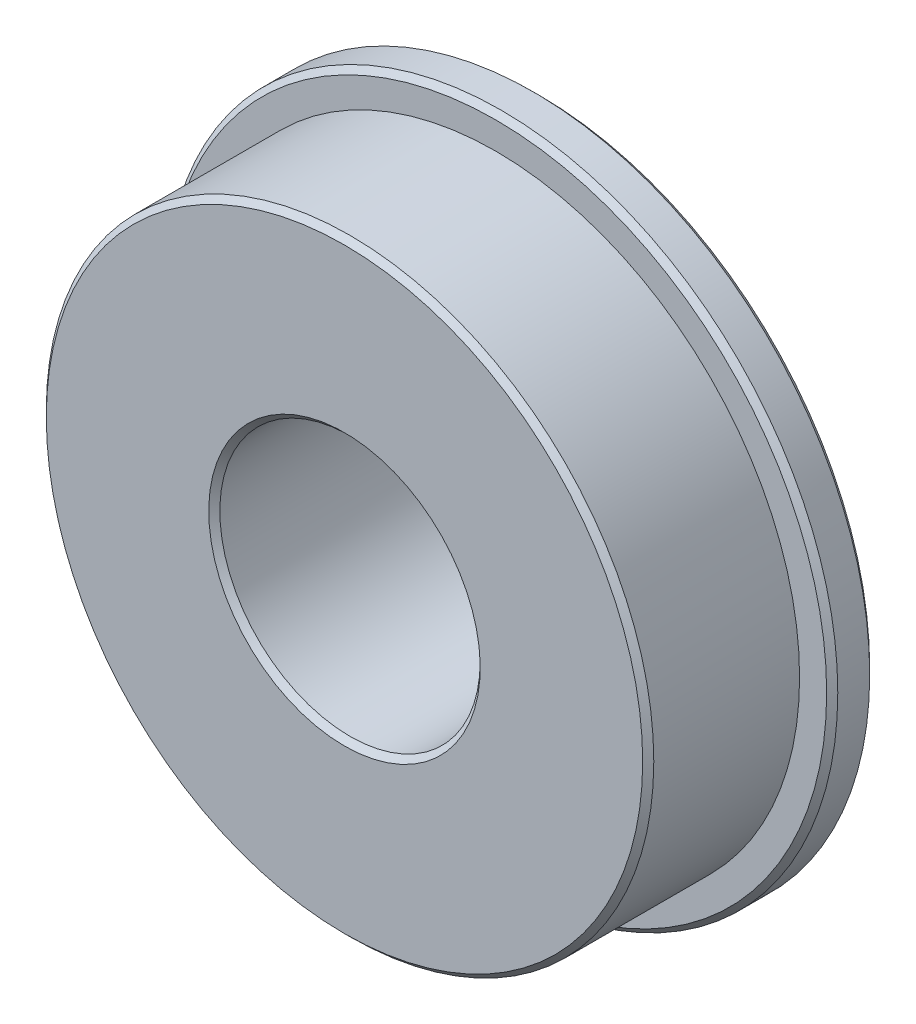
ISO-10303-21;
HEADER;
FILE_DESCRIPTION(('STEP AP214'),'2;1');
FILE_NAME('part.step','',(''),(''),'','','');
FILE_SCHEMA(('AUTOMOTIVE_DESIGN { 1 0 10303 214 1 1 1 1 }'));
ENDSEC;
DATA;
#1=APPLICATION_CONTEXT('core data for automotive mechanical design processes');
#2=APPLICATION_PROTOCOL_DEFINITION('international standard','automotive_design',2000,#1);
#3=PRODUCT_CONTEXT('',#1,'mechanical');
#4=PRODUCT('Part','Part','',(#3));
#5=PRODUCT_RELATED_PRODUCT_CATEGORY('part','',(#4));
#6=PRODUCT_DEFINITION_FORMATION('','',#4);
#7=PRODUCT_DEFINITION_CONTEXT('part definition',#1,'design');
#8=PRODUCT_DEFINITION('design','',#6,#7);
#9=PRODUCT_DEFINITION_SHAPE('','',#8);
#10=(LENGTH_UNIT() NAMED_UNIT(*) SI_UNIT(.MILLI.,.METRE.));
#11=(NAMED_UNIT(*) PLANE_ANGLE_UNIT() SI_UNIT($,.RADIAN.));
#12=(NAMED_UNIT(*) SI_UNIT($,.STERADIAN.) SOLID_ANGLE_UNIT());
#13=UNCERTAINTY_MEASURE_WITH_UNIT(LENGTH_MEASURE(1.E-05),#10,'distance_accuracy_value','');
#14=(GEOMETRIC_REPRESENTATION_CONTEXT(3) GLOBAL_UNCERTAINTY_ASSIGNED_CONTEXT((#13)) GLOBAL_UNIT_ASSIGNED_CONTEXT((#10,
#11,#12)) REPRESENTATION_CONTEXT('',''));
#15=CARTESIAN_POINT('',(0.,0.,0.));
#16=DIRECTION('',(0.,0.,1.));
#17=DIRECTION('',(1.,0.,0.));
#18=AXIS2_PLACEMENT_3D('',#15,#16,#17);
#19=CARTESIAN_POINT('',(75.6412,76.2,29.8196));
#20=DIRECTION('',(0.,0.,-1.));
#21=DIRECTION('',(-1.,0.,0.));
#22=AXIS2_PLACEMENT_3D('',#19,#20,#21);
#23=CONICAL_SURFACE('',#22,11.1125,0.78539816339744);
#24=CARTESIAN_POINT('',(75.6412,76.2,29.8196));
#25=DIRECTION('',(0.,0.,1.));
#26=DIRECTION('',(1.,0.,0.));
#27=AXIS2_PLACEMENT_3D('',#24,#25,#26);
#28=CIRCLE('',#27,11.1125);
#29=CARTESIAN_POINT('',(86.7537,76.2,29.8196));
#30=VERTEX_POINT('',#29);
#31=EDGE_CURVE('E30',#30,#30,#28,.F.);
#32=ORIENTED_EDGE('',*,*,#31,.F.);
#33=EDGE_LOOP('',(#32));
#34=FACE_BOUND('',#33,.T.);
#35=CARTESIAN_POINT('',(75.6412,76.2,30.0228));
#36=DIRECTION('',(0.,0.,-1.));
#37=DIRECTION('',(-1.,0.,0.));
#38=AXIS2_PLACEMENT_3D('',#35,#36,#37);
#39=CIRCLE('',#38,10.9093);
#40=CARTESIAN_POINT('',(64.7319,76.2,30.0228));
#41=VERTEX_POINT('',#40);
#42=EDGE_CURVE('E18',#41,#41,#39,.F.);
#43=ORIENTED_EDGE('',*,*,#42,.F.);
#44=EDGE_LOOP('',(#43));
#45=FACE_BOUND('',#44,.T.);
#46=ADVANCED_FACE('F15',(#34,#45),#23,.T.);
#47=CARTESIAN_POINT('',(75.6412,76.2,22.9108));
#48=DIRECTION('',(0.,0.,1.));
#49=DIRECTION('',(1.,0.,0.));
#50=AXIS2_PLACEMENT_3D('',#47,#48,#49);
#51=CYLINDRICAL_SURFACE('',#50,11.1125);
#52=CARTESIAN_POINT('',(75.6412,76.2,24.4856));
#53=DIRECTION('',(0.,0.,1.));
#54=DIRECTION('',(1.,0.,0.));
#55=AXIS2_PLACEMENT_3D('',#52,#53,#54);
#56=CIRCLE('',#55,11.1125);
#57=CARTESIAN_POINT('',(86.7537,76.2,24.4856));
#58=VERTEX_POINT('',#57);
#59=EDGE_CURVE('E39',#58,#58,#56,.F.);
#60=ORIENTED_EDGE('',*,*,#59,.F.);
#61=EDGE_LOOP('',(#60));
#62=FACE_BOUND('',#61,.T.);
#63=ORIENTED_EDGE('',*,*,#31,.T.);
#64=EDGE_LOOP('',(#63));
#65=FACE_BOUND('',#64,.T.);
#66=ADVANCED_FACE('F49',(#62,#65),#51,.T.);
#67=CARTESIAN_POINT('',(80.4037,76.2,30.0228));
#68=DIRECTION('',(0.,0.,1.));
#69=DIRECTION('',(1.,0.,0.));
#70=AXIS2_PLACEMENT_3D('',#67,#68,#69);
#71=PLANE('',#70);
#72=ORIENTED_EDGE('',*,*,#42,.T.);
#73=EDGE_LOOP('',(#72));
#74=FACE_BOUND('',#73,.T.);
#75=CARTESIAN_POINT('',(75.6412,76.2,30.0227999999834));
#76=DIRECTION('',(0.,0.,1.));
#77=DIRECTION('',(0.,-1.,0.));
#78=AXIS2_PLACEMENT_3D('',#75,#76,#77);
#79=CIRCLE('',#78,4.96569999996384);
#80=CARTESIAN_POINT('',(75.6412,71.2343000000362,30.0227999999834));
#81=VERTEX_POINT('',#80);
#82=EDGE_CURVE('E37',#81,#81,#79,.F.);
#83=ORIENTED_EDGE('',*,*,#82,.T.);
#84=EDGE_LOOP('',(#83));
#85=FACE_BOUND('',#84,.T.);
#86=ADVANCED_FACE('F57',(#74,#85),#71,.T.);
#87=CARTESIAN_POINT('',(86.7537,76.2,24.4856));
#88=DIRECTION('',(0.,0.,1.));
#89=DIRECTION('',(1.,0.,0.));
#90=AXIS2_PLACEMENT_3D('',#87,#88,#89);
#91=PLANE('',#90);
#92=ORIENTED_EDGE('',*,*,#59,.T.);
#93=EDGE_LOOP('',(#92));
#94=FACE_BOUND('',#93,.T.);
#95=CARTESIAN_POINT('',(75.6412,76.2,24.4856));
#96=DIRECTION('',(0.,0.,-1.));
#97=DIRECTION('',(0.,1.,0.));
#98=AXIS2_PLACEMENT_3D('',#95,#96,#97);
#99=CIRCLE('',#98,12.1031);
#100=CARTESIAN_POINT('',(75.6412,88.3031,24.4856));
#101=VERTEX_POINT('',#100);
#102=EDGE_CURVE('E33',#101,#101,#99,.T.);
#103=ORIENTED_EDGE('',*,*,#102,.F.);
#104=EDGE_LOOP('',(#103));
#105=FACE_BOUND('',#104,.T.);
#106=ADVANCED_FACE('F89',(#94,#105),#91,.T.);
#107=CARTESIAN_POINT('',(75.6412,76.2,30.0227999998697));
#108=DIRECTION('',(0.,0.,1.));
#109=DIRECTION('',(0.,-1.,0.));
#110=AXIS2_PLACEMENT_3D('',#107,#108,#109);
#111=CONICAL_SURFACE('',#110,4.96569999985015,0.785398163397448);
#112=CARTESIAN_POINT('',(75.6412,76.2,29.8196));
#113=DIRECTION('',(0.,0.,1.));
#114=DIRECTION('',(1.,0.,0.));
#115=AXIS2_PLACEMENT_3D('',#112,#113,#114);
#116=CIRCLE('',#115,4.7625);
#117=CARTESIAN_POINT('',(80.4037,76.2,29.8196));
#118=VERTEX_POINT('',#117);
#119=EDGE_CURVE('E36',#118,#118,#116,.F.);
#120=ORIENTED_EDGE('',*,*,#119,.T.);
#121=EDGE_LOOP('',(#120));
#122=FACE_BOUND('',#121,.T.);
#123=ORIENTED_EDGE('',*,*,#82,.F.);
#124=EDGE_LOOP('',(#123));
#125=FACE_BOUND('',#124,.T.);
#126=ADVANCED_FACE('F85',(#122,#125),#111,.F.);
#127=CARTESIAN_POINT('',(75.6412,76.2,24.2824));
#128=DIRECTION('',(0.,0.,-1.));
#129=DIRECTION('',(0.,1.,0.));
#130=AXIS2_PLACEMENT_3D('',#127,#128,#129);
#131=CONICAL_SURFACE('',#130,12.3063,0.785398163397457);
#132=CARTESIAN_POINT('',(75.6412,76.2,24.2824));
#133=DIRECTION('',(0.,0.,1.));
#134=DIRECTION('',(1.,0.,0.));
#135=AXIS2_PLACEMENT_3D('',#132,#133,#134);
#136=CIRCLE('',#135,12.3063);
#137=CARTESIAN_POINT('',(87.9475,76.2,24.2824));
#138=VERTEX_POINT('',#137);
#139=EDGE_CURVE('E172',#138,#138,#136,.F.);
#140=ORIENTED_EDGE('',*,*,#139,.F.);
#141=EDGE_LOOP('',(#140));
#142=FACE_BOUND('',#141,.T.);
#143=ORIENTED_EDGE('',*,*,#102,.T.);
#144=EDGE_LOOP('',(#143));
#145=FACE_BOUND('',#144,.T.);
#146=ADVANCED_FACE('F81',(#142,#145),#131,.T.);
#147=CARTESIAN_POINT('',(75.6412,76.2,22.9108));
#148=DIRECTION('',(0.,0.,1.));
#149=DIRECTION('',(1.,0.,0.));
#150=AXIS2_PLACEMENT_3D('',#147,#148,#149);
#151=CYLINDRICAL_SURFACE('',#150,4.7625);
#152=CARTESIAN_POINT('',(75.6412,76.2,23.114000000021));
#153=DIRECTION('',(0.,0.,-1.));
#154=DIRECTION('',(-1.,0.,0.));
#155=AXIS2_PLACEMENT_3D('',#152,#153,#154);
#156=CIRCLE('',#155,4.76249999996296);
#157=CARTESIAN_POINT('',(70.878700000037,76.2,23.114000000021));
#158=VERTEX_POINT('',#157);
#159=EDGE_CURVE('E174',#158,#158,#156,.T.);
#160=ORIENTED_EDGE('',*,*,#159,.T.);
#161=EDGE_LOOP('',(#160));
#162=FACE_BOUND('',#161,.T.);
#163=ORIENTED_EDGE('',*,*,#119,.F.);
#164=EDGE_LOOP('',(#163));
#165=FACE_BOUND('',#164,.T.);
#166=ADVANCED_FACE('F77',(#162,#165),#151,.F.);
#167=CARTESIAN_POINT('',(75.6412,76.2,22.9108));
#168=DIRECTION('',(0.,0.,1.));
#169=DIRECTION('',(1.,0.,0.));
#170=AXIS2_PLACEMENT_3D('',#167,#168,#169);
#171=CYLINDRICAL_SURFACE('',#170,12.3063);
#172=ORIENTED_EDGE('',*,*,#139,.T.);
#173=EDGE_LOOP('',(#172));
#174=FACE_BOUND('',#173,.T.);
#175=CARTESIAN_POINT('',(75.6412,76.2,23.114));
#176=DIRECTION('',(0.,0.,1.));
#177=DIRECTION('',(1.,0.,0.));
#178=AXIS2_PLACEMENT_3D('',#175,#176,#177);
#179=CIRCLE('',#178,12.3063);
#180=CARTESIAN_POINT('',(87.9475,76.2,23.114));
#181=VERTEX_POINT('',#180);
#182=EDGE_CURVE('E27',#181,#181,#179,.F.);
#183=ORIENTED_EDGE('',*,*,#182,.F.);
#184=EDGE_LOOP('',(#183));
#185=FACE_BOUND('',#184,.T.);
#186=ADVANCED_FACE('F73',(#174,#185),#171,.T.);
#187=CARTESIAN_POINT('',(75.6412,76.2,22.9108000000906));
#188=DIRECTION('',(0.,0.,-1.));
#189=DIRECTION('',(-1.,0.,0.));
#190=AXIS2_PLACEMENT_3D('',#187,#188,#189);
#191=CONICAL_SURFACE('',#190,4.96569999995015,0.785398163537319);
#192=ORIENTED_EDGE('',*,*,#159,.F.);
#193=EDGE_LOOP('',(#192));
#194=FACE_BOUND('',#193,.T.);
#195=CARTESIAN_POINT('',(75.6412,76.2,22.9108000000269));
#196=DIRECTION('',(0.,0.,-1.));
#197=DIRECTION('',(-1.,0.,0.));
#198=AXIS2_PLACEMENT_3D('',#195,#196,#197);
#199=CIRCLE('',#198,4.96570000001384);
#200=CARTESIAN_POINT('',(70.6754999999862,76.2,22.9108000000269));
#201=VERTEX_POINT('',#200);
#202=EDGE_CURVE('E22',#201,#201,#199,.F.);
#203=ORIENTED_EDGE('',*,*,#202,.F.);
#204=EDGE_LOOP('',(#203));
#205=FACE_BOUND('',#204,.T.);
#206=ADVANCED_FACE('F66',(#194,#205),#191,.F.);
#207=CARTESIAN_POINT('',(75.6412,76.2,23.114));
#208=DIRECTION('',(0.,0.,1.));
#209=DIRECTION('',(1.,0.,0.));
#210=AXIS2_PLACEMENT_3D('',#207,#208,#209);
#211=CONICAL_SURFACE('',#210,12.3063,0.785398163397414);
#212=ORIENTED_EDGE('',*,*,#182,.T.);
#213=EDGE_LOOP('',(#212));
#214=FACE_BOUND('',#213,.T.);
#215=CARTESIAN_POINT('',(75.6412,76.2,22.9108));
#216=DIRECTION('',(0.,0.,1.));
#217=DIRECTION('',(1.,0.,0.));
#218=AXIS2_PLACEMENT_3D('',#215,#216,#217);
#219=CIRCLE('',#218,12.1031);
#220=CARTESIAN_POINT('',(87.7443,76.2,22.9108));
#221=VERTEX_POINT('',#220);
#222=EDGE_CURVE('E10',#221,#221,#219,.F.);
#223=ORIENTED_EDGE('',*,*,#222,.F.);
#224=EDGE_LOOP('',(#223));
#225=FACE_BOUND('',#224,.T.);
#226=ADVANCED_FACE('F61',(#214,#225),#211,.T.);
#227=CARTESIAN_POINT('',(87.9475,76.2,22.9108));
#228=DIRECTION('',(0.,0.,-1.));
#229=DIRECTION('',(-1.,0.,0.));
#230=AXIS2_PLACEMENT_3D('',#227,#228,#229);
#231=PLANE('',#230);
#232=ORIENTED_EDGE('',*,*,#222,.T.);
#233=EDGE_LOOP('',(#232));
#234=FACE_BOUND('',#233,.T.);
#235=ORIENTED_EDGE('',*,*,#202,.T.);
#236=EDGE_LOOP('',(#235));
#237=FACE_BOUND('',#236,.T.);
#238=ADVANCED_FACE('F59',(#234,#237),#231,.T.);
#239=CLOSED_SHELL('',(#46,#66,#86,#106,#126,#146,#166,#186,#206,#226,#238));
#240=MANIFOLD_SOLID_BREP('B1',#239);
#241=ADVANCED_BREP_SHAPE_REPRESENTATION('',(#18,#240),#14);
#242=SHAPE_DEFINITION_REPRESENTATION(#9,#241);
ENDSEC;
END-ISO-10303-21;
